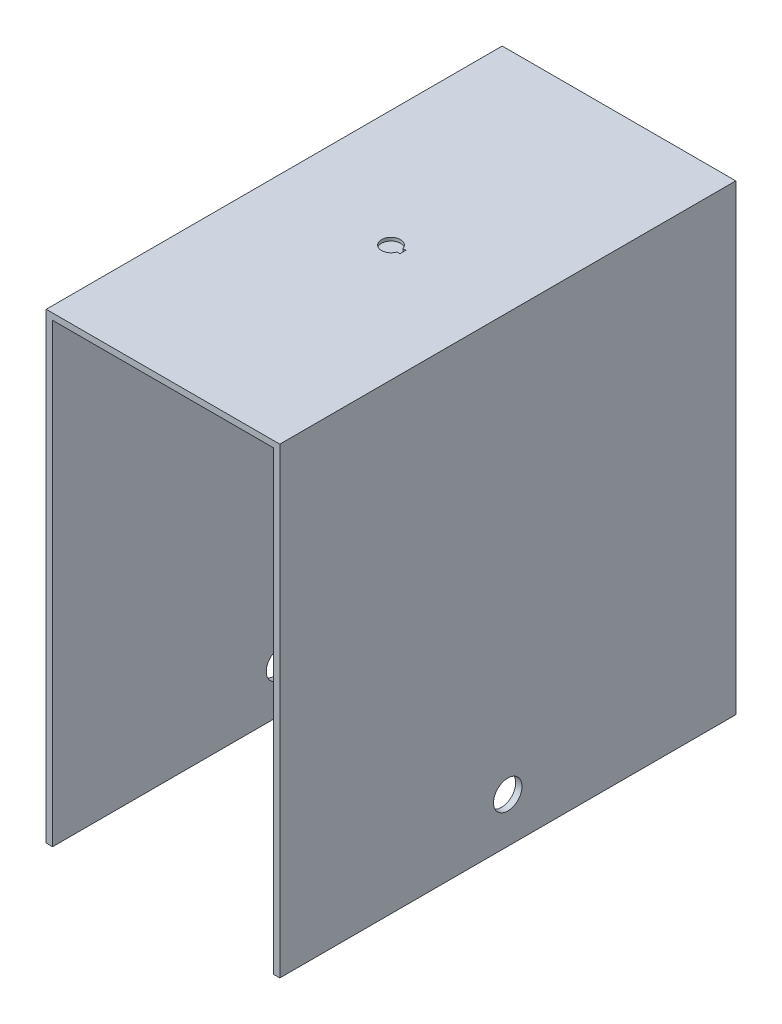
ISO-10303-21;
HEADER;
FILE_DESCRIPTION(('STEP AP214'),'2;1');
FILE_NAME('part.step','',(''),(''),'','','');
FILE_SCHEMA(('AUTOMOTIVE_DESIGN { 1 0 10303 214 1 1 1 1 }'));
ENDSEC;
DATA;
#1=APPLICATION_CONTEXT('core data for automotive mechanical design processes');
#2=APPLICATION_PROTOCOL_DEFINITION('international standard','automotive_design',2000,#1);
#3=PRODUCT_CONTEXT('',#1,'mechanical');
#4=PRODUCT('Part','Part','',(#3));
#5=PRODUCT_RELATED_PRODUCT_CATEGORY('part','',(#4));
#6=PRODUCT_DEFINITION_FORMATION('','',#4);
#7=PRODUCT_DEFINITION_CONTEXT('part definition',#1,'design');
#8=PRODUCT_DEFINITION('design','',#6,#7);
#9=PRODUCT_DEFINITION_SHAPE('','',#8);
#10=(LENGTH_UNIT() NAMED_UNIT(*) SI_UNIT(.MILLI.,.METRE.));
#11=(NAMED_UNIT(*) PLANE_ANGLE_UNIT() SI_UNIT($,.RADIAN.));
#12=(NAMED_UNIT(*) SI_UNIT($,.STERADIAN.) SOLID_ANGLE_UNIT());
#13=UNCERTAINTY_MEASURE_WITH_UNIT(LENGTH_MEASURE(1.E-05),#10,'distance_accuracy_value','');
#14=(GEOMETRIC_REPRESENTATION_CONTEXT(3) GLOBAL_UNCERTAINTY_ASSIGNED_CONTEXT((#13)) GLOBAL_UNIT_ASSIGNED_CONTEXT((#10,
#11,#12)) REPRESENTATION_CONTEXT('',''));
#15=CARTESIAN_POINT('',(0.,0.,0.));
#16=DIRECTION('',(0.,0.,1.));
#17=DIRECTION('',(1.,0.,0.));
#18=AXIS2_PLACEMENT_3D('',#15,#16,#17);
#19=CARTESIAN_POINT('',(117.095,-6.35,228.6));
#20=DIRECTION('',(1.,0.,0.));
#21=DIRECTION('',(0.,0.,-1.));
#22=AXIS2_PLACEMENT_3D('',#19,#20,#21);
#23=PLANE('',#22);
#24=CARTESIAN_POINT('',(117.095,-418.55,0.));
#25=DIRECTION('',(1.,0.,0.));
#26=DIRECTION('',(0.,0.,-1.));
#27=AXIS2_PLACEMENT_3D('',#24,#25,#26);
#28=CIRCLE('',#27,14.29);
#29=CARTESIAN_POINT('',(117.095,-418.55,-14.2900000000001));
#30=VERTEX_POINT('',#29);
#31=EDGE_CURVE('E165',#30,#30,#28,.T.);
#32=ORIENTED_EDGE('',*,*,#31,.F.);
#33=EDGE_LOOP('',(#32));
#34=FACE_BOUND('',#33,.T.);
#35=DIRECTION('',(0.,0.,-1.));
#36=VECTOR('',#35,1.);
#37=CARTESIAN_POINT('',(117.095,0.,228.6));
#38=LINE('',#37,#36);
#39=CARTESIAN_POINT('',(117.095,0.,228.6));
#40=VERTEX_POINT('',#39);
#41=CARTESIAN_POINT('',(117.095,0.,-228.6));
#42=VERTEX_POINT('',#41);
#43=EDGE_CURVE('E213',#40,#42,#38,.T.);
#44=ORIENTED_EDGE('',*,*,#43,.F.);
#45=DIRECTION('',(0.,1.,0.));
#46=VECTOR('',#45,1.);
#47=CARTESIAN_POINT('',(117.095,-6.35,228.6));
#48=LINE('',#47,#46);
#49=CARTESIAN_POINT('',(117.095,-463.55,228.6));
#50=VERTEX_POINT('',#49);
#51=EDGE_CURVE('E11',#50,#40,#48,.T.);
#52=ORIENTED_EDGE('',*,*,#51,.F.);
#53=DIRECTION('',(0.,0.,-1.));
#54=VECTOR('',#53,1.);
#55=CARTESIAN_POINT('',(117.095,-463.55,228.6));
#56=LINE('',#55,#54);
#57=CARTESIAN_POINT('',(117.095,-463.55,-228.6));
#58=VERTEX_POINT('',#57);
#59=EDGE_CURVE('E177',#50,#58,#56,.T.);
#60=ORIENTED_EDGE('',*,*,#59,.T.);
#61=DIRECTION('',(0.,1.,0.));
#62=VECTOR('',#61,1.);
#63=CARTESIAN_POINT('',(117.095,-6.35,-228.6));
#64=LINE('',#63,#62);
#65=EDGE_CURVE('E220',#58,#42,#64,.T.);
#66=ORIENTED_EDGE('',*,*,#65,.T.);
#67=EDGE_LOOP('',(#44,#52,#60,#66));
#68=FACE_BOUND('',#67,.T.);
#69=ADVANCED_FACE('F41',(#34,#68),#23,.T.);
#70=CARTESIAN_POINT('',(-117.095,-6.35,228.6));
#71=DIRECTION('',(0.,0.,1.));
#72=DIRECTION('',(1.,0.,0.));
#73=AXIS2_PLACEMENT_3D('',#70,#71,#72);
#74=PLANE('',#73);
#75=DIRECTION('',(1.,0.,0.));
#76=VECTOR('',#75,1.);
#77=CARTESIAN_POINT('',(-117.095,0.,228.6));
#78=LINE('',#77,#76);
#79=CARTESIAN_POINT('',(-117.095,0.,228.6));
#80=VERTEX_POINT('',#79);
#81=EDGE_CURVE('E217',#80,#40,#78,.T.);
#82=ORIENTED_EDGE('',*,*,#81,.F.);
#83=DIRECTION('',(0.,1.,0.));
#84=VECTOR('',#83,1.);
#85=CARTESIAN_POINT('',(-117.095,-6.35,228.6));
#86=LINE('',#85,#84);
#87=CARTESIAN_POINT('',(-117.095,-463.55,228.6));
#88=VERTEX_POINT('',#87);
#89=EDGE_CURVE('E49',#88,#80,#86,.T.);
#90=ORIENTED_EDGE('',*,*,#89,.F.);
#91=DIRECTION('',(-1.,0.,0.));
#92=VECTOR('',#91,1.);
#93=CARTESIAN_POINT('',(-117.095,-463.55,228.6));
#94=LINE('',#93,#92);
#95=CARTESIAN_POINT('',(-110.745,-463.55,228.6));
#96=VERTEX_POINT('',#95);
#97=EDGE_CURVE('E202',#96,#88,#94,.T.);
#98=ORIENTED_EDGE('',*,*,#97,.F.);
#99=DIRECTION('',(0.,1.,0.));
#100=VECTOR('',#99,1.);
#101=CARTESIAN_POINT('',(-110.745,-463.55,228.6));
#102=LINE('',#101,#100);
#103=CARTESIAN_POINT('',(-110.745,-6.35,228.6));
#104=VERTEX_POINT('',#103);
#105=EDGE_CURVE('E205',#96,#104,#102,.T.);
#106=ORIENTED_EDGE('',*,*,#105,.T.);
#107=DIRECTION('',(1.,0.,0.));
#108=VECTOR('',#107,1.);
#109=CARTESIAN_POINT('',(-117.095,-6.35,228.6));
#110=LINE('',#109,#108);
#111=CARTESIAN_POINT('',(110.745,-6.35,228.6));
#112=VERTEX_POINT('',#111);
#113=EDGE_CURVE('E216',#104,#112,#110,.T.);
#114=ORIENTED_EDGE('',*,*,#113,.T.);
#115=DIRECTION('',(0.,1.,0.));
#116=VECTOR('',#115,1.);
#117=CARTESIAN_POINT('',(110.745,-463.55,228.6));
#118=LINE('',#117,#116);
#119=CARTESIAN_POINT('',(110.745,-463.55,228.6));
#120=VERTEX_POINT('',#119);
#121=EDGE_CURVE('E192',#120,#112,#118,.T.);
#122=ORIENTED_EDGE('',*,*,#121,.F.);
#123=DIRECTION('',(1.,0.,0.));
#124=VECTOR('',#123,1.);
#125=CARTESIAN_POINT('',(117.095,-463.55,228.6));
#126=LINE('',#125,#124);
#127=EDGE_CURVE('E180',#120,#50,#126,.T.);
#128=ORIENTED_EDGE('',*,*,#127,.T.);
#129=ORIENTED_EDGE('',*,*,#51,.T.);
#130=EDGE_LOOP('',(#82,#90,#98,#106,#114,#122,#128,#129));
#131=FACE_BOUND('',#130,.T.);
#132=ADVANCED_FACE('F246',(#131),#74,.T.);
#133=CARTESIAN_POINT('',(-117.095,-6.35,228.6));
#134=DIRECTION('',(-1.,0.,0.));
#135=DIRECTION('',(0.,0.,1.));
#136=AXIS2_PLACEMENT_3D('',#133,#134,#135);
#137=PLANE('',#136);
#138=CARTESIAN_POINT('',(-117.095,-418.55,0.));
#139=DIRECTION('',(-1.,0.,0.));
#140=DIRECTION('',(0.,0.,1.));
#141=AXIS2_PLACEMENT_3D('',#138,#139,#140);
#142=CIRCLE('',#141,14.29);
#143=CARTESIAN_POINT('',(-117.095,-418.55,14.29));
#144=VERTEX_POINT('',#143);
#145=EDGE_CURVE('E174',#144,#144,#142,.T.);
#146=ORIENTED_EDGE('',*,*,#145,.F.);
#147=EDGE_LOOP('',(#146));
#148=FACE_BOUND('',#147,.T.);
#149=DIRECTION('',(0.,0.,1.));
#150=VECTOR('',#149,1.);
#151=CARTESIAN_POINT('',(-117.095,0.,228.6));
#152=LINE('',#151,#150);
#153=CARTESIAN_POINT('',(-117.095,0.,-228.6));
#154=VERTEX_POINT('',#153);
#155=EDGE_CURVE('E226',#154,#80,#152,.T.);
#156=ORIENTED_EDGE('',*,*,#155,.F.);
#157=DIRECTION('',(0.,1.,0.));
#158=VECTOR('',#157,1.);
#159=CARTESIAN_POINT('',(-117.095,-6.35,-228.6));
#160=LINE('',#159,#158);
#161=CARTESIAN_POINT('',(-117.095,-463.55,-228.6));
#162=VERTEX_POINT('',#161);
#163=EDGE_CURVE('E232',#162,#154,#160,.T.);
#164=ORIENTED_EDGE('',*,*,#163,.F.);
#165=DIRECTION('',(0.,0.,-1.));
#166=VECTOR('',#165,1.);
#167=CARTESIAN_POINT('',(-117.095,-463.55,228.6));
#168=LINE('',#167,#166);
#169=EDGE_CURVE('E195',#88,#162,#168,.T.);
#170=ORIENTED_EDGE('',*,*,#169,.F.);
#171=ORIENTED_EDGE('',*,*,#89,.T.);
#172=EDGE_LOOP('',(#156,#164,#170,#171));
#173=FACE_BOUND('',#172,.T.);
#174=ADVANCED_FACE('F265',(#148,#173),#137,.T.);
#175=CARTESIAN_POINT('',(-117.095,-6.35,-228.6));
#176=DIRECTION('',(0.,0.,-1.));
#177=DIRECTION('',(-1.,0.,0.));
#178=AXIS2_PLACEMENT_3D('',#175,#176,#177);
#179=PLANE('',#178);
#180=DIRECTION('',(-1.,0.,0.));
#181=VECTOR('',#180,1.);
#182=CARTESIAN_POINT('',(-117.095,0.,-228.6));
#183=LINE('',#182,#181);
#184=EDGE_CURVE('E223',#42,#154,#183,.T.);
#185=ORIENTED_EDGE('',*,*,#184,.F.);
#186=ORIENTED_EDGE('',*,*,#65,.F.);
#187=DIRECTION('',(-1.,0.,0.));
#188=VECTOR('',#187,1.);
#189=CARTESIAN_POINT('',(117.095,-463.55,-228.6));
#190=LINE('',#189,#188);
#191=CARTESIAN_POINT('',(110.745,-463.55,-228.6));
#192=VERTEX_POINT('',#191);
#193=EDGE_CURVE('E186',#58,#192,#190,.T.);
#194=ORIENTED_EDGE('',*,*,#193,.T.);
#195=DIRECTION('',(0.,1.,0.));
#196=VECTOR('',#195,1.);
#197=CARTESIAN_POINT('',(110.745,-463.55,-228.6));
#198=LINE('',#197,#196);
#199=CARTESIAN_POINT('',(110.745,-6.35,-228.6));
#200=VERTEX_POINT('',#199);
#201=EDGE_CURVE('E189',#192,#200,#198,.T.);
#202=ORIENTED_EDGE('',*,*,#201,.T.);
#203=DIRECTION('',(-1.,0.,0.));
#204=VECTOR('',#203,1.);
#205=CARTESIAN_POINT('',(-117.095,-6.35,-228.6));
#206=LINE('',#205,#204);
#207=CARTESIAN_POINT('',(-110.745,-6.35,-228.6));
#208=VERTEX_POINT('',#207);
#209=EDGE_CURVE('E214',#200,#208,#206,.T.);
#210=ORIENTED_EDGE('',*,*,#209,.T.);
#211=DIRECTION('',(0.,1.,0.));
#212=VECTOR('',#211,1.);
#213=CARTESIAN_POINT('',(-110.745,-463.55,-228.6));
#214=LINE('',#213,#212);
#215=CARTESIAN_POINT('',(-110.745,-463.55,-228.6));
#216=VERTEX_POINT('',#215);
#217=EDGE_CURVE('E210',#216,#208,#214,.T.);
#218=ORIENTED_EDGE('',*,*,#217,.F.);
#219=DIRECTION('',(1.,0.,0.));
#220=VECTOR('',#219,1.);
#221=CARTESIAN_POINT('',(-117.095,-463.55,-228.6));
#222=LINE('',#221,#220);
#223=EDGE_CURVE('E198',#162,#216,#222,.T.);
#224=ORIENTED_EDGE('',*,*,#223,.F.);
#225=ORIENTED_EDGE('',*,*,#163,.T.);
#226=EDGE_LOOP('',(#185,#186,#194,#202,#210,#218,#224,#225));
#227=FACE_BOUND('',#226,.T.);
#228=ADVANCED_FACE('F239',(#227),#179,.T.);
#229=CARTESIAN_POINT('',(0.,-6.35,0.));
#230=DIRECTION('',(0.,-1.,0.));
#231=DIRECTION('',(0.,0.,-1.));
#232=AXIS2_PLACEMENT_3D('',#229,#230,#231);
#233=PLANE('',#232);
#234=DIRECTION('',(0.,0.,1.));
#235=VECTOR('',#234,1.);
#236=CARTESIAN_POINT('',(110.745,-6.35,228.6));
#237=LINE('',#236,#235);
#238=EDGE_CURVE('E65',#200,#112,#237,.T.);
#239=ORIENTED_EDGE('',*,*,#238,.T.);
#240=ORIENTED_EDGE('',*,*,#113,.F.);
#241=DIRECTION('',(0.,0.,1.));
#242=VECTOR('',#241,1.);
#243=CARTESIAN_POINT('',(-110.745,-6.35,228.6));
#244=LINE('',#243,#242);
#245=EDGE_CURVE('E194',#208,#104,#244,.T.);
#246=ORIENTED_EDGE('',*,*,#245,.F.);
#247=ORIENTED_EDGE('',*,*,#209,.F.);
#248=EDGE_LOOP('',(#239,#240,#246,#247));
#249=FACE_BOUND('',#248,.T.);
#250=ADVANCED_FACE('F256',(#249),#233,.T.);
#251=CARTESIAN_POINT('',(0.,0.,0.));
#252=DIRECTION('',(0.,-1.,0.));
#253=DIRECTION('',(0.,0.,-1.));
#254=AXIS2_PLACEMENT_3D('',#251,#252,#253);
#255=PLANE('',#254);
#256=DIRECTION('',(-1.,0.,0.));
#257=VECTOR('',#256,1.);
#258=CARTESIAN_POINT('',(9.01387818865997,0.,-3.));
#259=LINE('',#258,#257);
#260=CARTESIAN_POINT('',(12.,0.,-3.));
#261=VERTEX_POINT('',#260);
#262=CARTESIAN_POINT('',(9.01387818865997,0.,-3.));
#263=VERTEX_POINT('',#262);
#264=EDGE_CURVE('E159',#261,#263,#259,.T.);
#265=ORIENTED_EDGE('',*,*,#264,.F.);
#266=DIRECTION('',(0.,0.,-1.));
#267=VECTOR('',#266,1.);
#268=CARTESIAN_POINT('',(12.,0.,-3.));
#269=LINE('',#268,#267);
#270=CARTESIAN_POINT('',(12.,0.,3.));
#271=VERTEX_POINT('',#270);
#272=EDGE_CURVE('E57',#271,#261,#269,.T.);
#273=ORIENTED_EDGE('',*,*,#272,.F.);
#274=DIRECTION('',(1.,0.,0.));
#275=VECTOR('',#274,1.);
#276=CARTESIAN_POINT('',(9.01387818865997,0.,3.));
#277=LINE('',#276,#275);
#278=CARTESIAN_POINT('',(9.01387818865997,0.,3.));
#279=VERTEX_POINT('',#278);
#280=EDGE_CURVE('E150',#279,#271,#277,.T.);
#281=ORIENTED_EDGE('',*,*,#280,.F.);
#282=CARTESIAN_POINT('',(0.,0.,0.));
#283=DIRECTION('',(0.,1.,0.));
#284=DIRECTION('',(0.,0.,1.));
#285=AXIS2_PLACEMENT_3D('',#282,#283,#284);
#286=CIRCLE('',#285,9.5);
#287=EDGE_CURVE('E153',#263,#279,#286,.T.);
#288=ORIENTED_EDGE('',*,*,#287,.F.);
#289=EDGE_LOOP('',(#265,#273,#281,#288));
#290=FACE_BOUND('',#289,.T.);
#291=ORIENTED_EDGE('',*,*,#43,.T.);
#292=ORIENTED_EDGE('',*,*,#184,.T.);
#293=ORIENTED_EDGE('',*,*,#155,.T.);
#294=ORIENTED_EDGE('',*,*,#81,.T.);
#295=EDGE_LOOP('',(#291,#292,#293,#294));
#296=FACE_BOUND('',#295,.T.);
#297=ADVANCED_FACE('F243',(#290,#296),#255,.F.);
#298=CARTESIAN_POINT('',(-110.745,-463.55,228.6));
#299=DIRECTION('',(-1.,0.,0.));
#300=DIRECTION('',(0.,0.,1.));
#301=AXIS2_PLACEMENT_3D('',#298,#299,#300);
#302=PLANE('',#301);
#303=CARTESIAN_POINT('',(-110.745,-418.55,0.));
#304=DIRECTION('',(-1.,0.,0.));
#305=DIRECTION('',(0.,0.,1.));
#306=AXIS2_PLACEMENT_3D('',#303,#304,#305);
#307=CIRCLE('',#306,14.29);
#308=CARTESIAN_POINT('',(-110.745,-418.55,14.29));
#309=VERTEX_POINT('',#308);
#310=EDGE_CURVE('E171',#309,#309,#307,.T.);
#311=ORIENTED_EDGE('',*,*,#310,.T.);
#312=EDGE_LOOP('',(#311));
#313=FACE_BOUND('',#312,.T.);
#314=ORIENTED_EDGE('',*,*,#245,.T.);
#315=ORIENTED_EDGE('',*,*,#105,.F.);
#316=DIRECTION('',(0.,0.,1.));
#317=VECTOR('',#316,1.);
#318=CARTESIAN_POINT('',(-110.745,-463.55,228.6));
#319=LINE('',#318,#317);
#320=EDGE_CURVE('E200',#216,#96,#319,.T.);
#321=ORIENTED_EDGE('',*,*,#320,.F.);
#322=ORIENTED_EDGE('',*,*,#217,.T.);
#323=EDGE_LOOP('',(#314,#315,#321,#322));
#324=FACE_BOUND('',#323,.T.);
#325=ADVANCED_FACE('F260',(#313,#324),#302,.F.);
#326=CARTESIAN_POINT('',(0.,-463.55,0.));
#327=DIRECTION('',(0.,-1.,0.));
#328=DIRECTION('',(0.,0.,-1.));
#329=AXIS2_PLACEMENT_3D('',#326,#327,#328);
#330=PLANE('',#329);
#331=ORIENTED_EDGE('',*,*,#169,.T.);
#332=ORIENTED_EDGE('',*,*,#223,.T.);
#333=ORIENTED_EDGE('',*,*,#320,.T.);
#334=ORIENTED_EDGE('',*,*,#97,.T.);
#335=EDGE_LOOP('',(#331,#332,#333,#334));
#336=FACE_BOUND('',#335,.T.);
#337=ADVANCED_FACE('F263',(#336),#330,.T.);
#338=CARTESIAN_POINT('',(110.745,-463.55,228.6));
#339=DIRECTION('',(-1.,0.,0.));
#340=DIRECTION('',(0.,0.,1.));
#341=AXIS2_PLACEMENT_3D('',#338,#339,#340);
#342=PLANE('',#341);
#343=CARTESIAN_POINT('',(110.745,-418.55,0.));
#344=DIRECTION('',(-1.,0.,0.));
#345=DIRECTION('',(0.,0.,1.));
#346=AXIS2_PLACEMENT_3D('',#343,#344,#345);
#347=CIRCLE('',#346,14.29);
#348=CARTESIAN_POINT('',(110.745,-418.55,14.29));
#349=VERTEX_POINT('',#348);
#350=EDGE_CURVE('E44',#349,#349,#347,.T.);
#351=ORIENTED_EDGE('',*,*,#350,.F.);
#352=EDGE_LOOP('',(#351));
#353=FACE_BOUND('',#352,.T.);
#354=ORIENTED_EDGE('',*,*,#238,.F.);
#355=ORIENTED_EDGE('',*,*,#201,.F.);
#356=DIRECTION('',(0.,0.,1.));
#357=VECTOR('',#356,1.);
#358=CARTESIAN_POINT('',(110.745,-463.55,228.6));
#359=LINE('',#358,#357);
#360=EDGE_CURVE('E183',#192,#120,#359,.T.);
#361=ORIENTED_EDGE('',*,*,#360,.T.);
#362=ORIENTED_EDGE('',*,*,#121,.T.);
#363=EDGE_LOOP('',(#354,#355,#361,#362));
#364=FACE_BOUND('',#363,.T.);
#365=ADVANCED_FACE('F293',(#353,#364),#342,.T.);
#366=CARTESIAN_POINT('',(0.,-463.55,0.));
#367=DIRECTION('',(0.,-1.,0.));
#368=DIRECTION('',(0.,0.,-1.));
#369=AXIS2_PLACEMENT_3D('',#366,#367,#368);
#370=PLANE('',#369);
#371=ORIENTED_EDGE('',*,*,#59,.F.);
#372=ORIENTED_EDGE('',*,*,#127,.F.);
#373=ORIENTED_EDGE('',*,*,#360,.F.);
#374=ORIENTED_EDGE('',*,*,#193,.F.);
#375=EDGE_LOOP('',(#371,#372,#373,#374));
#376=FACE_BOUND('',#375,.T.);
#377=ADVANCED_FACE('F250',(#376),#370,.T.);
#378=CARTESIAN_POINT('',(-441.705,-418.55,0.));
#379=DIRECTION('',(1.,0.,0.));
#380=DIRECTION('',(0.,0.,-1.));
#381=AXIS2_PLACEMENT_3D('',#378,#379,#380);
#382=CYLINDRICAL_SURFACE('',#381,14.29);
#383=ORIENTED_EDGE('',*,*,#350,.T.);
#384=EDGE_LOOP('',(#383));
#385=FACE_BOUND('',#384,.T.);
#386=ORIENTED_EDGE('',*,*,#31,.T.);
#387=EDGE_LOOP('',(#386));
#388=FACE_BOUND('',#387,.T.);
#389=ADVANCED_FACE('F283',(#385,#388),#382,.F.);
#390=ORIENTED_EDGE('',*,*,#145,.T.);
#391=EDGE_LOOP('',(#390));
#392=FACE_BOUND('',#391,.T.);
#393=ORIENTED_EDGE('',*,*,#310,.F.);
#394=EDGE_LOOP('',(#393));
#395=FACE_BOUND('',#394,.T.);
#396=ADVANCED_FACE('F285',(#392,#395),#382,.F.);
#397=CARTESIAN_POINT('',(12.,-3.25,-3.));
#398=DIRECTION('',(1.,0.,0.));
#399=DIRECTION('',(0.,0.,-1.));
#400=AXIS2_PLACEMENT_3D('',#397,#398,#399);
#401=PLANE('',#400);
#402=ORIENTED_EDGE('',*,*,#272,.T.);
#403=DIRECTION('',(0.,1.,0.));
#404=VECTOR('',#403,1.);
#405=CARTESIAN_POINT('',(12.,-3.25,-3.));
#406=LINE('',#405,#404);
#407=CARTESIAN_POINT('',(12.,-3.25,-3.));
#408=VERTEX_POINT('',#407);
#409=EDGE_CURVE('E128',#408,#261,#406,.T.);
#410=ORIENTED_EDGE('',*,*,#409,.F.);
#411=DIRECTION('',(0.,0.,-1.));
#412=VECTOR('',#411,1.);
#413=CARTESIAN_POINT('',(12.,-3.25,-3.));
#414=LINE('',#413,#412);
#415=CARTESIAN_POINT('',(12.,-3.25,3.));
#416=VERTEX_POINT('',#415);
#417=EDGE_CURVE('E132',#416,#408,#414,.T.);
#418=ORIENTED_EDGE('',*,*,#417,.F.);
#419=DIRECTION('',(0.,1.,0.));
#420=VECTOR('',#419,1.);
#421=CARTESIAN_POINT('',(12.,-3.25,3.));
#422=LINE('',#421,#420);
#423=EDGE_CURVE('E163',#416,#271,#422,.T.);
#424=ORIENTED_EDGE('',*,*,#423,.T.);
#425=EDGE_LOOP('',(#402,#410,#418,#424));
#426=FACE_BOUND('',#425,.T.);
#427=ADVANCED_FACE('F130',(#426),#401,.F.);
#428=CARTESIAN_POINT('',(9.01387818865997,-3.25,3.));
#429=DIRECTION('',(0.,0.,1.));
#430=DIRECTION('',(1.,0.,0.));
#431=AXIS2_PLACEMENT_3D('',#428,#429,#430);
#432=PLANE('',#431);
#433=ORIENTED_EDGE('',*,*,#280,.T.);
#434=ORIENTED_EDGE('',*,*,#423,.F.);
#435=DIRECTION('',(1.,0.,0.));
#436=VECTOR('',#435,1.);
#437=CARTESIAN_POINT('',(9.01387818865997,-3.25,3.));
#438=LINE('',#437,#436);
#439=CARTESIAN_POINT('',(9.01387818865997,-3.25,3.));
#440=VERTEX_POINT('',#439);
#441=EDGE_CURVE('E138',#440,#416,#438,.T.);
#442=ORIENTED_EDGE('',*,*,#441,.F.);
#443=DIRECTION('',(0.,1.,0.));
#444=VECTOR('',#443,1.);
#445=CARTESIAN_POINT('',(9.01387818865997,-3.25,3.));
#446=LINE('',#445,#444);
#447=EDGE_CURVE('E166',#440,#279,#446,.T.);
#448=ORIENTED_EDGE('',*,*,#447,.T.);
#449=EDGE_LOOP('',(#433,#434,#442,#448));
#450=FACE_BOUND('',#449,.T.);
#451=ADVANCED_FACE('F317',(#450),#432,.F.);
#452=CARTESIAN_POINT('',(0.,-3.25,0.));
#453=DIRECTION('',(0.,1.,0.));
#454=DIRECTION('',(0.,0.,1.));
#455=AXIS2_PLACEMENT_3D('',#452,#453,#454);
#456=CYLINDRICAL_SURFACE('',#455,9.5);
#457=ORIENTED_EDGE('',*,*,#287,.T.);
#458=ORIENTED_EDGE('',*,*,#447,.F.);
#459=CARTESIAN_POINT('',(0.,-3.25,0.));
#460=DIRECTION('',(0.,1.,0.));
#461=DIRECTION('',(0.,0.,1.));
#462=AXIS2_PLACEMENT_3D('',#459,#460,#461);
#463=CIRCLE('',#462,9.5);
#464=CARTESIAN_POINT('',(9.01387818865997,-3.25,-3.));
#465=VERTEX_POINT('',#464);
#466=EDGE_CURVE('E146',#465,#440,#463,.T.);
#467=ORIENTED_EDGE('',*,*,#466,.F.);
#468=DIRECTION('',(0.,1.,0.));
#469=VECTOR('',#468,1.);
#470=CARTESIAN_POINT('',(9.01387818865997,-3.25,-3.));
#471=LINE('',#470,#469);
#472=EDGE_CURVE('E137',#465,#263,#471,.T.);
#473=ORIENTED_EDGE('',*,*,#472,.T.);
#474=EDGE_LOOP('',(#457,#458,#467,#473));
#475=FACE_BOUND('',#474,.T.);
#476=ADVANCED_FACE('F315',(#475),#456,.F.);
#477=CARTESIAN_POINT('',(9.01387818865997,-3.25,-3.));
#478=DIRECTION('',(0.,0.,-1.));
#479=DIRECTION('',(-1.,0.,0.));
#480=AXIS2_PLACEMENT_3D('',#477,#478,#479);
#481=PLANE('',#480);
#482=ORIENTED_EDGE('',*,*,#264,.T.);
#483=ORIENTED_EDGE('',*,*,#472,.F.);
#484=DIRECTION('',(-1.,0.,0.));
#485=VECTOR('',#484,1.);
#486=CARTESIAN_POINT('',(9.01387818865997,-3.25,-3.));
#487=LINE('',#486,#485);
#488=EDGE_CURVE('E141',#408,#465,#487,.T.);
#489=ORIENTED_EDGE('',*,*,#488,.F.);
#490=ORIENTED_EDGE('',*,*,#409,.T.);
#491=EDGE_LOOP('',(#482,#483,#489,#490));
#492=FACE_BOUND('',#491,.T.);
#493=ADVANCED_FACE('F142',(#492),#481,.F.);
#494=CARTESIAN_POINT('',(0.,-3.25,0.));
#495=DIRECTION('',(0.,1.,0.));
#496=DIRECTION('',(0.,0.,1.));
#497=AXIS2_PLACEMENT_3D('',#494,#495,#496);
#498=PLANE('',#497);
#499=ORIENTED_EDGE('',*,*,#417,.T.);
#500=ORIENTED_EDGE('',*,*,#488,.T.);
#501=ORIENTED_EDGE('',*,*,#466,.T.);
#502=ORIENTED_EDGE('',*,*,#441,.T.);
#503=EDGE_LOOP('',(#499,#500,#501,#502));
#504=FACE_BOUND('',#503,.T.);
#505=ADVANCED_FACE('F148',(#504),#498,.T.);
#506=CLOSED_SHELL('',(#69,#132,#174,#228,#250,#297,#325,#337,#365,#377,#389,#396,#427,#451,#476,
#493,#505));
#507=MANIFOLD_SOLID_BREP('B2',#506);
#508=ADVANCED_BREP_SHAPE_REPRESENTATION('',(#18,#507),#14);
#509=SHAPE_DEFINITION_REPRESENTATION(#9,#508);
ENDSEC;
END-ISO-10303-21;
